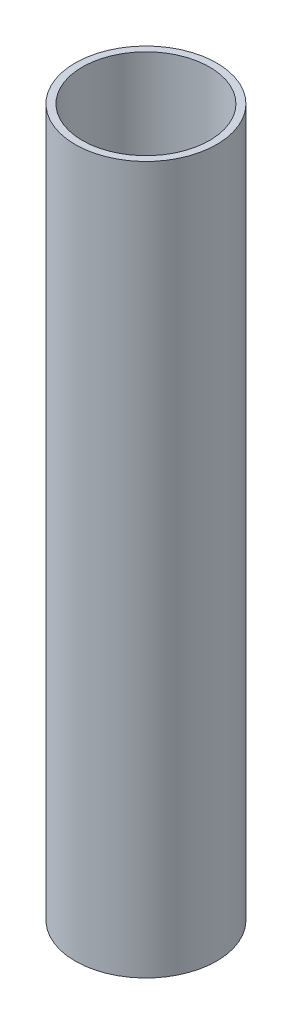
ISO-10303-21;
HEADER;
FILE_DESCRIPTION(('STEP AP214'),'2;1');
FILE_NAME('part.step','',(''),(''),'','','');
FILE_SCHEMA(('AUTOMOTIVE_DESIGN { 1 0 10303 214 1 1 1 1 }'));
ENDSEC;
DATA;
#1=APPLICATION_CONTEXT('core data for automotive mechanical design processes');
#2=APPLICATION_PROTOCOL_DEFINITION('international standard','automotive_design',2000,#1);
#3=PRODUCT_CONTEXT('',#1,'mechanical');
#4=PRODUCT('Part','Part','',(#3));
#5=PRODUCT_RELATED_PRODUCT_CATEGORY('part','',(#4));
#6=PRODUCT_DEFINITION_FORMATION('','',#4);
#7=PRODUCT_DEFINITION_CONTEXT('part definition',#1,'design');
#8=PRODUCT_DEFINITION('design','',#6,#7);
#9=PRODUCT_DEFINITION_SHAPE('','',#8);
#10=(LENGTH_UNIT() NAMED_UNIT(*) SI_UNIT(.MILLI.,.METRE.));
#11=(NAMED_UNIT(*) PLANE_ANGLE_UNIT() SI_UNIT($,.RADIAN.));
#12=(NAMED_UNIT(*) SI_UNIT($,.STERADIAN.) SOLID_ANGLE_UNIT());
#13=UNCERTAINTY_MEASURE_WITH_UNIT(LENGTH_MEASURE(1.E-05),#10,'distance_accuracy_value','');
#14=(GEOMETRIC_REPRESENTATION_CONTEXT(3) GLOBAL_UNCERTAINTY_ASSIGNED_CONTEXT((#13)) GLOBAL_UNIT_ASSIGNED_CONTEXT((#10,
#11,#12)) REPRESENTATION_CONTEXT('',''));
#15=CARTESIAN_POINT('',(0.,0.,0.));
#16=DIRECTION('',(0.,0.,1.));
#17=DIRECTION('',(1.,0.,0.));
#18=AXIS2_PLACEMENT_3D('',#15,#16,#17);
#19=CARTESIAN_POINT('',(-19.3896436082533,50.,-19.8743846984596));
#20=DIRECTION('',(0.,1.,0.));
#21=DIRECTION('',(0.,0.,1.));
#22=AXIS2_PLACEMENT_3D('',#19,#20,#21);
#23=PLANE('',#22);
#24=CARTESIAN_POINT('',(-19.3896436082533,50.,-19.8743846984596));
#25=DIRECTION('',(0.,1.,0.));
#26=DIRECTION('',(0.,0.,1.));
#27=AXIS2_PLACEMENT_3D('',#24,#25,#26);
#28=CIRCLE('',#27,5.);
#29=CARTESIAN_POINT('',(-19.3896436082533,50.,-14.8743846984596));
#30=VERTEX_POINT('',#29);
#31=EDGE_CURVE('E10',#30,#30,#28,.T.);
#32=ORIENTED_EDGE('',*,*,#31,.T.);
#33=EDGE_LOOP('',(#32));
#34=FACE_BOUND('',#33,.T.);
#35=CARTESIAN_POINT('',(-19.3896436082533,50.,-19.8743846984596));
#36=DIRECTION('',(0.,1.,0.));
#37=DIRECTION('',(0.,0.,1.));
#38=AXIS2_PLACEMENT_3D('',#35,#36,#37);
#39=CIRCLE('',#38,4.5);
#40=CARTESIAN_POINT('',(-19.3896436082533,50.,-15.3743846984596));
#41=VERTEX_POINT('',#40);
#42=EDGE_CURVE('E43',#41,#41,#39,.T.);
#43=ORIENTED_EDGE('',*,*,#42,.F.);
#44=EDGE_LOOP('',(#43));
#45=FACE_BOUND('',#44,.T.);
#46=ADVANCED_FACE('F32',(#34,#45),#23,.T.);
#47=CARTESIAN_POINT('',(-19.3896436082533,0.,-19.8743846984596));
#48=DIRECTION('',(0.,1.,0.));
#49=DIRECTION('',(0.,0.,1.));
#50=AXIS2_PLACEMENT_3D('',#47,#48,#49);
#51=PLANE('',#50);
#52=CARTESIAN_POINT('',(-19.3896436082533,0.,-19.8743846984596));
#53=DIRECTION('',(0.,1.,0.));
#54=DIRECTION('',(0.,0.,1.));
#55=AXIS2_PLACEMENT_3D('',#52,#53,#54);
#56=CIRCLE('',#55,5.);
#57=CARTESIAN_POINT('',(-19.3896436082533,0.,-14.8743846984596));
#58=VERTEX_POINT('',#57);
#59=EDGE_CURVE('E36',#58,#58,#56,.T.);
#60=ORIENTED_EDGE('',*,*,#59,.F.);
#61=EDGE_LOOP('',(#60));
#62=FACE_BOUND('',#61,.T.);
#63=CARTESIAN_POINT('',(-19.3896436082533,0.,-19.8743846984596));
#64=DIRECTION('',(0.,1.,0.));
#65=DIRECTION('',(0.,0.,1.));
#66=AXIS2_PLACEMENT_3D('',#63,#64,#65);
#67=CIRCLE('',#66,4.5);
#68=CARTESIAN_POINT('',(-19.3896436082533,0.,-15.3743846984596));
#69=VERTEX_POINT('',#68);
#70=EDGE_CURVE('E45',#69,#69,#67,.T.);
#71=ORIENTED_EDGE('',*,*,#70,.T.);
#72=EDGE_LOOP('',(#71));
#73=FACE_BOUND('',#72,.T.);
#74=ADVANCED_FACE('F55',(#62,#73),#51,.F.);
#75=CARTESIAN_POINT('',(-19.3896436082533,50.,-19.8743846984596));
#76=DIRECTION('',(0.,-1.,0.));
#77=DIRECTION('',(0.,0.,-1.));
#78=AXIS2_PLACEMENT_3D('',#75,#76,#77);
#79=CYLINDRICAL_SURFACE('',#78,5.);
#80=ORIENTED_EDGE('',*,*,#31,.F.);
#81=EDGE_LOOP('',(#80));
#82=FACE_BOUND('',#81,.T.);
#83=ORIENTED_EDGE('',*,*,#59,.T.);
#84=EDGE_LOOP('',(#83));
#85=FACE_BOUND('',#84,.T.);
#86=ADVANCED_FACE('F34',(#82,#85),#79,.T.);
#87=CARTESIAN_POINT('',(-19.3896436082533,50.,-19.8743846984596));
#88=DIRECTION('',(0.,-1.,0.));
#89=DIRECTION('',(0.,0.,-1.));
#90=AXIS2_PLACEMENT_3D('',#87,#88,#89);
#91=CYLINDRICAL_SURFACE('',#90,4.5);
#92=ORIENTED_EDGE('',*,*,#42,.T.);
#93=EDGE_LOOP('',(#92));
#94=FACE_BOUND('',#93,.T.);
#95=ORIENTED_EDGE('',*,*,#70,.F.);
#96=EDGE_LOOP('',(#95));
#97=FACE_BOUND('',#96,.T.);
#98=ADVANCED_FACE('F51',(#94,#97),#91,.F.);
#99=CLOSED_SHELL('',(#46,#74,#86,#98));
#100=MANIFOLD_SOLID_BREP('B2',#99);
#101=ADVANCED_BREP_SHAPE_REPRESENTATION('',(#18,#100),#14);
#102=SHAPE_DEFINITION_REPRESENTATION(#9,#101);
ENDSEC;
END-ISO-10303-21;
